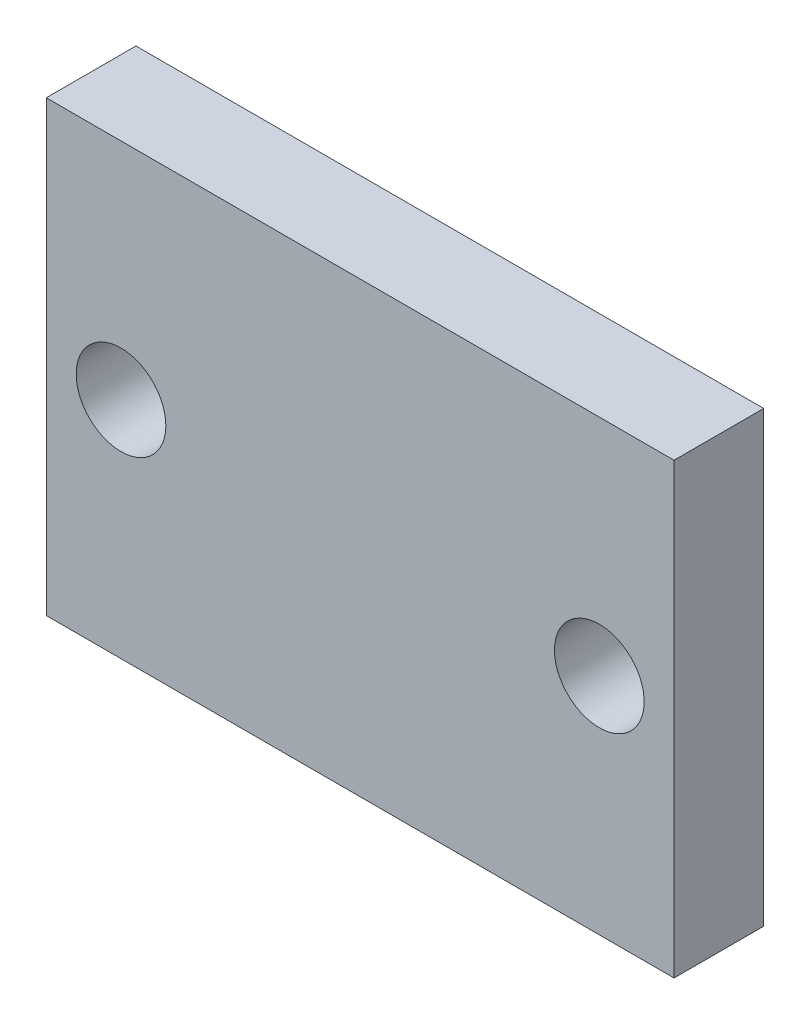
ISO-10303-21;
HEADER;
FILE_DESCRIPTION(('STEP AP214'),'2;1');
FILE_NAME('part.step','',(''),(''),'','','');
FILE_SCHEMA(('AUTOMOTIVE_DESIGN { 1 0 10303 214 1 1 1 1 }'));
ENDSEC;
DATA;
#1=APPLICATION_CONTEXT('core data for automotive mechanical design processes');
#2=APPLICATION_PROTOCOL_DEFINITION('international standard','automotive_design',2000,#1);
#3=PRODUCT_CONTEXT('',#1,'mechanical');
#4=PRODUCT('Part','Part','',(#3));
#5=PRODUCT_RELATED_PRODUCT_CATEGORY('part','',(#4));
#6=PRODUCT_DEFINITION_FORMATION('','',#4);
#7=PRODUCT_DEFINITION_CONTEXT('part definition',#1,'design');
#8=PRODUCT_DEFINITION('design','',#6,#7);
#9=PRODUCT_DEFINITION_SHAPE('','',#8);
#10=(LENGTH_UNIT() NAMED_UNIT(*) SI_UNIT(.MILLI.,.METRE.));
#11=(NAMED_UNIT(*) PLANE_ANGLE_UNIT() SI_UNIT($,.RADIAN.));
#12=(NAMED_UNIT(*) SI_UNIT($,.STERADIAN.) SOLID_ANGLE_UNIT());
#13=UNCERTAINTY_MEASURE_WITH_UNIT(LENGTH_MEASURE(1.E-05),#10,'distance_accuracy_value','');
#14=(GEOMETRIC_REPRESENTATION_CONTEXT(3) GLOBAL_UNCERTAINTY_ASSIGNED_CONTEXT((#13)) GLOBAL_UNIT_ASSIGNED_CONTEXT((#10,
#11,#12)) REPRESENTATION_CONTEXT('',''));
#15=CARTESIAN_POINT('',(0.,0.,0.));
#16=DIRECTION('',(0.,0.,1.));
#17=DIRECTION('',(1.,0.,0.));
#18=AXIS2_PLACEMENT_3D('',#15,#16,#17);
#19=CARTESIAN_POINT('',(0.,0.,3.));
#20=DIRECTION('',(0.,0.,1.));
#21=DIRECTION('',(1.,0.,0.));
#22=AXIS2_PLACEMENT_3D('',#19,#20,#21);
#23=PLANE('',#22);
#24=CARTESIAN_POINT('',(-8.,0.,3.));
#25=DIRECTION('',(0.,0.,1.));
#26=DIRECTION('',(1.,0.,0.));
#27=AXIS2_PLACEMENT_3D('',#24,#25,#26);
#28=CIRCLE('',#27,1.5);
#29=CARTESIAN_POINT('',(-6.5,0.,3.));
#30=VERTEX_POINT('',#29);
#31=EDGE_CURVE('E101',#30,#30,#28,.T.);
#32=ORIENTED_EDGE('',*,*,#31,.F.);
#33=EDGE_LOOP('',(#32));
#34=FACE_BOUND('',#33,.T.);
#35=DIRECTION('',(0.,1.,0.));
#36=VECTOR('',#35,1.);
#37=CARTESIAN_POINT('',(10.5,7.5,3.));
#38=LINE('',#37,#36);
#39=CARTESIAN_POINT('',(10.5,-7.5,3.));
#40=VERTEX_POINT('',#39);
#41=CARTESIAN_POINT('',(10.5,7.5,3.));
#42=VERTEX_POINT('',#41);
#43=EDGE_CURVE('E86',#40,#42,#38,.T.);
#44=ORIENTED_EDGE('',*,*,#43,.T.);
#45=DIRECTION('',(-1.,0.,0.));
#46=VECTOR('',#45,1.);
#47=CARTESIAN_POINT('',(-10.5,7.5,3.));
#48=LINE('',#47,#46);
#49=CARTESIAN_POINT('',(-10.5,7.5,3.));
#50=VERTEX_POINT('',#49);
#51=EDGE_CURVE('E81',#42,#50,#48,.T.);
#52=ORIENTED_EDGE('',*,*,#51,.T.);
#53=DIRECTION('',(0.,-1.,0.));
#54=VECTOR('',#53,1.);
#55=CARTESIAN_POINT('',(-10.5,7.5,3.));
#56=LINE('',#55,#54);
#57=CARTESIAN_POINT('',(-10.5,-7.5,3.));
#58=VERTEX_POINT('',#57);
#59=EDGE_CURVE('E84',#50,#58,#56,.T.);
#60=ORIENTED_EDGE('',*,*,#59,.T.);
#61=DIRECTION('',(1.,0.,0.));
#62=VECTOR('',#61,1.);
#63=CARTESIAN_POINT('',(-10.5,-7.5,3.));
#64=LINE('',#63,#62);
#65=EDGE_CURVE('E51',#58,#40,#64,.T.);
#66=ORIENTED_EDGE('',*,*,#65,.T.);
#67=EDGE_LOOP('',(#44,#52,#60,#66));
#68=FACE_BOUND('',#67,.T.);
#69=CARTESIAN_POINT('',(8.,0.,3.));
#70=DIRECTION('',(0.,0.,1.));
#71=DIRECTION('',(-1.,0.,0.));
#72=AXIS2_PLACEMENT_3D('',#69,#70,#71);
#73=CIRCLE('',#72,1.5);
#74=CARTESIAN_POINT('',(6.5,0.,3.));
#75=VERTEX_POINT('',#74);
#76=EDGE_CURVE('E116',#75,#75,#73,.T.);
#77=ORIENTED_EDGE('',*,*,#76,.F.);
#78=EDGE_LOOP('',(#77));
#79=FACE_BOUND('',#78,.T.);
#80=ADVANCED_FACE('F34',(#34,#68,#79),#23,.T.);
#81=CARTESIAN_POINT('',(0.,0.,0.));
#82=DIRECTION('',(0.,0.,1.));
#83=DIRECTION('',(1.,0.,0.));
#84=AXIS2_PLACEMENT_3D('',#81,#82,#83);
#85=PLANE('',#84);
#86=DIRECTION('',(0.,1.,0.));
#87=VECTOR('',#86,1.);
#88=CARTESIAN_POINT('',(10.5,7.5,0.));
#89=LINE('',#88,#87);
#90=CARTESIAN_POINT('',(10.5,-7.5,0.));
#91=VERTEX_POINT('',#90);
#92=CARTESIAN_POINT('',(10.5,7.5,0.));
#93=VERTEX_POINT('',#92);
#94=EDGE_CURVE('E98',#91,#93,#89,.T.);
#95=ORIENTED_EDGE('',*,*,#94,.F.);
#96=DIRECTION('',(1.,0.,0.));
#97=VECTOR('',#96,1.);
#98=CARTESIAN_POINT('',(-10.5,-7.5,0.));
#99=LINE('',#98,#97);
#100=CARTESIAN_POINT('',(-10.5,-7.5,0.));
#101=VERTEX_POINT('',#100);
#102=EDGE_CURVE('E74',#101,#91,#99,.T.);
#103=ORIENTED_EDGE('',*,*,#102,.F.);
#104=DIRECTION('',(0.,-1.,0.));
#105=VECTOR('',#104,1.);
#106=CARTESIAN_POINT('',(-10.5,7.5,0.));
#107=LINE('',#106,#105);
#108=CARTESIAN_POINT('',(-10.5,7.5,0.));
#109=VERTEX_POINT('',#108);
#110=EDGE_CURVE('E68',#109,#101,#107,.T.);
#111=ORIENTED_EDGE('',*,*,#110,.F.);
#112=DIRECTION('',(-1.,0.,0.));
#113=VECTOR('',#112,1.);
#114=CARTESIAN_POINT('',(-10.5,7.5,0.));
#115=LINE('',#114,#113);
#116=EDGE_CURVE('E90',#93,#109,#115,.T.);
#117=ORIENTED_EDGE('',*,*,#116,.F.);
#118=EDGE_LOOP('',(#95,#103,#111,#117));
#119=FACE_BOUND('',#118,.T.);
#120=CARTESIAN_POINT('',(-8.,0.,0.));
#121=DIRECTION('',(0.,0.,1.));
#122=DIRECTION('',(1.,0.,0.));
#123=AXIS2_PLACEMENT_3D('',#120,#121,#122);
#124=CIRCLE('',#123,1.5);
#125=CARTESIAN_POINT('',(-6.5,0.,0.));
#126=VERTEX_POINT('',#125);
#127=EDGE_CURVE('E113',#126,#126,#124,.T.);
#128=ORIENTED_EDGE('',*,*,#127,.T.);
#129=EDGE_LOOP('',(#128));
#130=FACE_BOUND('',#129,.T.);
#131=CARTESIAN_POINT('',(8.,0.,0.));
#132=DIRECTION('',(0.,0.,1.));
#133=DIRECTION('',(-1.,0.,0.));
#134=AXIS2_PLACEMENT_3D('',#131,#132,#133);
#135=CIRCLE('',#134,1.5);
#136=CARTESIAN_POINT('',(6.5,0.,0.));
#137=VERTEX_POINT('',#136);
#138=EDGE_CURVE('E119',#137,#137,#135,.T.);
#139=ORIENTED_EDGE('',*,*,#138,.T.);
#140=EDGE_LOOP('',(#139));
#141=FACE_BOUND('',#140,.T.);
#142=ADVANCED_FACE('F109',(#119,#130,#141),#85,.F.);
#143=CARTESIAN_POINT('',(10.5,7.5,3.));
#144=DIRECTION('',(-1.,0.,0.));
#145=DIRECTION('',(0.,-1.,0.));
#146=AXIS2_PLACEMENT_3D('',#143,#144,#145);
#147=PLANE('',#146);
#148=ORIENTED_EDGE('',*,*,#94,.T.);
#149=DIRECTION('',(0.,0.,-1.));
#150=VECTOR('',#149,1.);
#151=CARTESIAN_POINT('',(10.5,7.5,3.));
#152=LINE('',#151,#150);
#153=EDGE_CURVE('E11',#42,#93,#152,.T.);
#154=ORIENTED_EDGE('',*,*,#153,.F.);
#155=ORIENTED_EDGE('',*,*,#43,.F.);
#156=DIRECTION('',(0.,0.,-1.));
#157=VECTOR('',#156,1.);
#158=CARTESIAN_POINT('',(10.5,-7.5,3.));
#159=LINE('',#158,#157);
#160=EDGE_CURVE('E94',#40,#91,#159,.T.);
#161=ORIENTED_EDGE('',*,*,#160,.T.);
#162=EDGE_LOOP('',(#148,#154,#155,#161));
#163=FACE_BOUND('',#162,.T.);
#164=ADVANCED_FACE('F36',(#163),#147,.F.);
#165=CARTESIAN_POINT('',(-10.5,7.5,3.));
#166=DIRECTION('',(0.,-1.,0.));
#167=DIRECTION('',(0.,0.,-1.));
#168=AXIS2_PLACEMENT_3D('',#165,#166,#167);
#169=PLANE('',#168);
#170=ORIENTED_EDGE('',*,*,#116,.T.);
#171=DIRECTION('',(0.,0.,-1.));
#172=VECTOR('',#171,1.);
#173=CARTESIAN_POINT('',(-10.5,7.5,3.));
#174=LINE('',#173,#172);
#175=EDGE_CURVE('E43',#50,#109,#174,.T.);
#176=ORIENTED_EDGE('',*,*,#175,.F.);
#177=ORIENTED_EDGE('',*,*,#51,.F.);
#178=ORIENTED_EDGE('',*,*,#153,.T.);
#179=EDGE_LOOP('',(#170,#176,#177,#178));
#180=FACE_BOUND('',#179,.T.);
#181=ADVANCED_FACE('F89',(#180),#169,.F.);
#182=CARTESIAN_POINT('',(-10.5,7.5,3.));
#183=DIRECTION('',(1.,0.,0.));
#184=DIRECTION('',(0.,1.,0.));
#185=AXIS2_PLACEMENT_3D('',#182,#183,#184);
#186=PLANE('',#185);
#187=ORIENTED_EDGE('',*,*,#110,.T.);
#188=DIRECTION('',(0.,0.,-1.));
#189=VECTOR('',#188,1.);
#190=CARTESIAN_POINT('',(-10.5,-7.5,3.));
#191=LINE('',#190,#189);
#192=EDGE_CURVE('E91',#58,#101,#191,.T.);
#193=ORIENTED_EDGE('',*,*,#192,.F.);
#194=ORIENTED_EDGE('',*,*,#59,.F.);
#195=ORIENTED_EDGE('',*,*,#175,.T.);
#196=EDGE_LOOP('',(#187,#193,#194,#195));
#197=FACE_BOUND('',#196,.T.);
#198=ADVANCED_FACE('F92',(#197),#186,.F.);
#199=CARTESIAN_POINT('',(-10.5,-7.5,3.));
#200=DIRECTION('',(0.,1.,0.));
#201=DIRECTION('',(0.,0.,1.));
#202=AXIS2_PLACEMENT_3D('',#199,#200,#201);
#203=PLANE('',#202);
#204=ORIENTED_EDGE('',*,*,#102,.T.);
#205=ORIENTED_EDGE('',*,*,#160,.F.);
#206=ORIENTED_EDGE('',*,*,#65,.F.);
#207=ORIENTED_EDGE('',*,*,#192,.T.);
#208=EDGE_LOOP('',(#204,#205,#206,#207));
#209=FACE_BOUND('',#208,.T.);
#210=ADVANCED_FACE('F106',(#209),#203,.F.);
#211=CARTESIAN_POINT('',(-8.,0.,3.));
#212=DIRECTION('',(0.,0.,-1.));
#213=DIRECTION('',(-1.,0.,0.));
#214=AXIS2_PLACEMENT_3D('',#211,#212,#213);
#215=CYLINDRICAL_SURFACE('',#214,1.5);
#216=ORIENTED_EDGE('',*,*,#31,.T.);
#217=EDGE_LOOP('',(#216));
#218=FACE_BOUND('',#217,.T.);
#219=ORIENTED_EDGE('',*,*,#127,.F.);
#220=EDGE_LOOP('',(#219));
#221=FACE_BOUND('',#220,.T.);
#222=ADVANCED_FACE('F136',(#218,#221),#215,.F.);
#223=CARTESIAN_POINT('',(8.,0.,3.));
#224=DIRECTION('',(0.,0.,-1.));
#225=DIRECTION('',(-1.,0.,0.));
#226=AXIS2_PLACEMENT_3D('',#223,#224,#225);
#227=CYLINDRICAL_SURFACE('',#226,1.5);
#228=ORIENTED_EDGE('',*,*,#76,.T.);
#229=EDGE_LOOP('',(#228));
#230=FACE_BOUND('',#229,.T.);
#231=ORIENTED_EDGE('',*,*,#138,.F.);
#232=EDGE_LOOP('',(#231));
#233=FACE_BOUND('',#232,.T.);
#234=ADVANCED_FACE('F125',(#230,#233),#227,.F.);
#235=CLOSED_SHELL('',(#80,#142,#164,#181,#198,#210,#222,#234));
#236=MANIFOLD_SOLID_BREP('B2',#235);
#237=ADVANCED_BREP_SHAPE_REPRESENTATION('',(#18,#236),#14);
#238=SHAPE_DEFINITION_REPRESENTATION(#9,#237);
ENDSEC;
END-ISO-10303-21;
